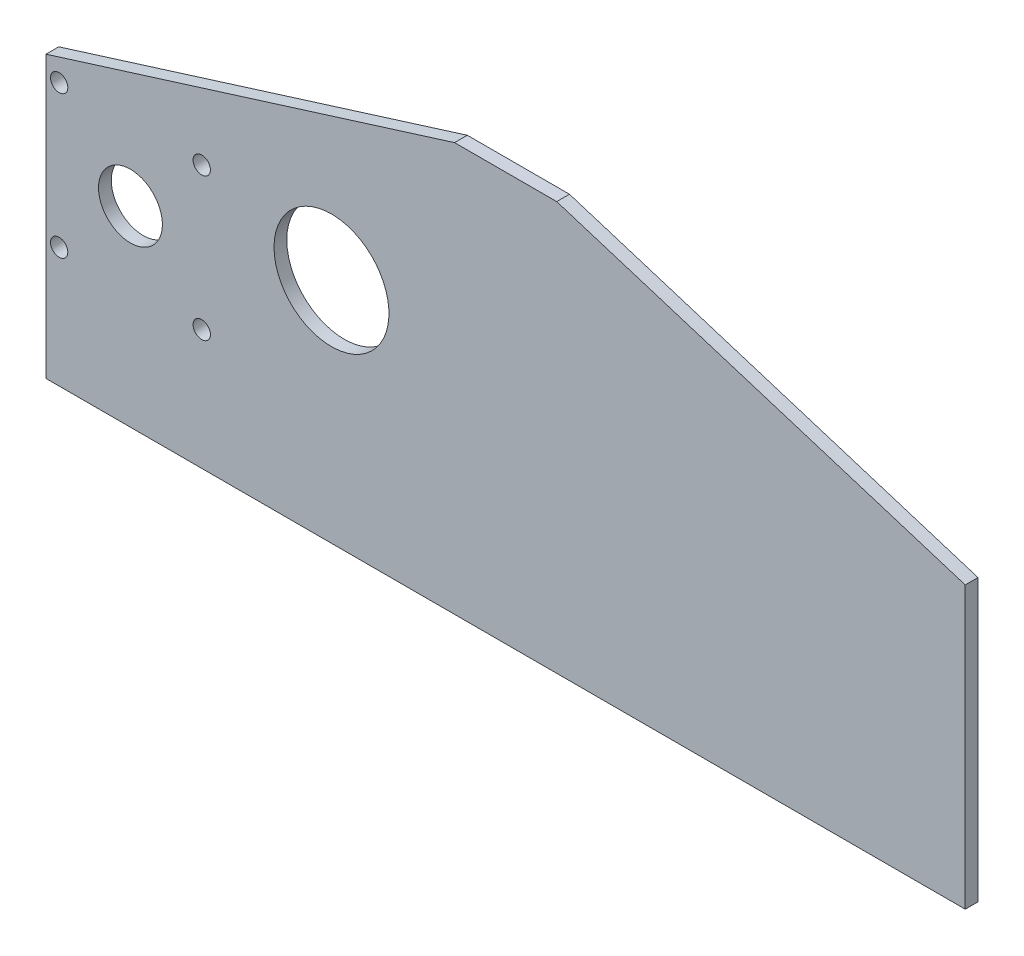
ISO-10303-21;
HEADER;
FILE_DESCRIPTION(('STEP AP214'),'2;1');
FILE_NAME('part.step','',(''),(''),'','','');
FILE_SCHEMA(('AUTOMOTIVE_DESIGN { 1 0 10303 214 1 1 1 1 }'));
ENDSEC;
DATA;
#1=APPLICATION_CONTEXT('core data for automotive mechanical design processes');
#2=APPLICATION_PROTOCOL_DEFINITION('international standard','automotive_design',2000,#1);
#3=PRODUCT_CONTEXT('',#1,'mechanical');
#4=PRODUCT('Part','Part','',(#3));
#5=PRODUCT_RELATED_PRODUCT_CATEGORY('part','',(#4));
#6=PRODUCT_DEFINITION_FORMATION('','',#4);
#7=PRODUCT_DEFINITION_CONTEXT('part definition',#1,'design');
#8=PRODUCT_DEFINITION('design','',#6,#7);
#9=PRODUCT_DEFINITION_SHAPE('','',#8);
#10=(LENGTH_UNIT() NAMED_UNIT(*) SI_UNIT(.MILLI.,.METRE.));
#11=(NAMED_UNIT(*) PLANE_ANGLE_UNIT() SI_UNIT($,.RADIAN.));
#12=(NAMED_UNIT(*) SI_UNIT($,.STERADIAN.) SOLID_ANGLE_UNIT());
#13=UNCERTAINTY_MEASURE_WITH_UNIT(LENGTH_MEASURE(1.E-05),#10,'distance_accuracy_value','');
#14=(GEOMETRIC_REPRESENTATION_CONTEXT(3) GLOBAL_UNCERTAINTY_ASSIGNED_CONTEXT((#13)) GLOBAL_UNIT_ASSIGNED_CONTEXT((#10,
#11,#12)) REPRESENTATION_CONTEXT('',''));
#15=CARTESIAN_POINT('',(0.,0.,0.));
#16=DIRECTION('',(0.,0.,1.));
#17=DIRECTION('',(1.,0.,0.));
#18=AXIS2_PLACEMENT_3D('',#15,#16,#17);
#19=CARTESIAN_POINT('',(25.4,101.6,3.175));
#20=DIRECTION('',(0.,-1.,0.));
#21=DIRECTION('',(1.,0.,0.));
#22=AXIS2_PLACEMENT_3D('',#19,#20,#21);
#23=PLANE('',#22);
#24=DIRECTION('',(-1.,0.,0.));
#25=VECTOR('',#24,1.);
#26=CARTESIAN_POINT('',(25.4,101.6,0.));
#27=LINE('',#26,#25);
#28=CARTESIAN_POINT('',(25.4,101.6,0.));
#29=VERTEX_POINT('',#28);
#30=CARTESIAN_POINT('',(0.,101.6,0.));
#31=VERTEX_POINT('',#30);
#32=EDGE_CURVE('E116',#29,#31,#27,.T.);
#33=ORIENTED_EDGE('',*,*,#32,.T.);
#34=DIRECTION('',(0.,0.,-1.));
#35=VECTOR('',#34,1.);
#36=CARTESIAN_POINT('',(0.,101.6,3.175));
#37=LINE('',#36,#35);
#38=CARTESIAN_POINT('',(0.,101.6,3.175));
#39=VERTEX_POINT('',#38);
#40=EDGE_CURVE('E11',#39,#31,#37,.T.);
#41=ORIENTED_EDGE('',*,*,#40,.F.);
#42=DIRECTION('',(-1.,0.,0.));
#43=VECTOR('',#42,1.);
#44=CARTESIAN_POINT('',(25.4,101.6,3.175));
#45=LINE('',#44,#43);
#46=CARTESIAN_POINT('',(25.4,101.6,3.175));
#47=VERTEX_POINT('',#46);
#48=EDGE_CURVE('E128',#47,#39,#45,.T.);
#49=ORIENTED_EDGE('',*,*,#48,.F.);
#50=DIRECTION('',(0.,0.,-1.));
#51=VECTOR('',#50,1.);
#52=CARTESIAN_POINT('',(25.4,101.6,3.175));
#53=LINE('',#52,#51);
#54=EDGE_CURVE('E112',#47,#29,#53,.T.);
#55=ORIENTED_EDGE('',*,*,#54,.T.);
#56=EDGE_LOOP('',(#33,#41,#49,#55));
#57=FACE_BOUND('',#56,.T.);
#58=ADVANCED_FACE('F33',(#57),#23,.F.);
#59=CARTESIAN_POINT('',(0.,101.6,3.175));
#60=DIRECTION('',(0.298274993135947,-0.95447997803503,0.));
#61=DIRECTION('',(0.95447997803503,0.298274993135947,0.));
#62=AXIS2_PLACEMENT_3D('',#59,#60,#61);
#63=PLANE('',#62);
#64=DIRECTION('',(-0.95447997803503,-0.298274993135947,0.));
#65=VECTOR('',#64,1.);
#66=CARTESIAN_POINT('',(0.,101.6,0.));
#67=LINE('',#66,#65);
#68=CARTESIAN_POINT('',(-101.6,69.85,0.));
#69=VERTEX_POINT('',#68);
#70=EDGE_CURVE('E119',#31,#69,#67,.T.);
#71=ORIENTED_EDGE('',*,*,#70,.T.);
#72=DIRECTION('',(0.,0.,-1.));
#73=VECTOR('',#72,1.);
#74=CARTESIAN_POINT('',(-101.6,69.85,3.175));
#75=LINE('',#74,#73);
#76=CARTESIAN_POINT('',(-101.6,69.85,3.175));
#77=VERTEX_POINT('',#76);
#78=EDGE_CURVE('E41',#77,#69,#75,.T.);
#79=ORIENTED_EDGE('',*,*,#78,.F.);
#80=DIRECTION('',(-0.95447997803503,-0.298274993135947,0.));
#81=VECTOR('',#80,1.);
#82=CARTESIAN_POINT('',(0.,101.6,3.175));
#83=LINE('',#82,#81);
#84=EDGE_CURVE('E86',#39,#77,#83,.T.);
#85=ORIENTED_EDGE('',*,*,#84,.F.);
#86=ORIENTED_EDGE('',*,*,#40,.T.);
#87=EDGE_LOOP('',(#71,#79,#85,#86));
#88=FACE_BOUND('',#87,.T.);
#89=ADVANCED_FACE('F153',(#88),#63,.F.);
#90=CARTESIAN_POINT('',(-101.6,69.85,3.175));
#91=DIRECTION('',(1.,0.,0.));
#92=DIRECTION('',(0.,1.,0.));
#93=AXIS2_PLACEMENT_3D('',#90,#91,#92);
#94=PLANE('',#93);
#95=DIRECTION('',(0.,-1.,0.));
#96=VECTOR('',#95,1.);
#97=CARTESIAN_POINT('',(-101.6,69.85,0.));
#98=LINE('',#97,#96);
#99=CARTESIAN_POINT('',(-101.6,0.,0.));
#100=VERTEX_POINT('',#99);
#101=EDGE_CURVE('E122',#69,#100,#98,.T.);
#102=ORIENTED_EDGE('',*,*,#101,.T.);
#103=DIRECTION('',(0.,0.,-1.));
#104=VECTOR('',#103,1.);
#105=CARTESIAN_POINT('',(-101.6,0.,3.175));
#106=LINE('',#105,#104);
#107=CARTESIAN_POINT('',(-101.6,0.,3.175));
#108=VERTEX_POINT('',#107);
#109=EDGE_CURVE('E107',#108,#100,#106,.T.);
#110=ORIENTED_EDGE('',*,*,#109,.F.);
#111=DIRECTION('',(0.,-1.,0.));
#112=VECTOR('',#111,1.);
#113=CARTESIAN_POINT('',(-101.6,69.85,3.175));
#114=LINE('',#113,#112);
#115=EDGE_CURVE('E99',#77,#108,#114,.T.);
#116=ORIENTED_EDGE('',*,*,#115,.F.);
#117=ORIENTED_EDGE('',*,*,#78,.T.);
#118=EDGE_LOOP('',(#102,#110,#116,#117));
#119=FACE_BOUND('',#118,.T.);
#120=ADVANCED_FACE('F134',(#119),#94,.F.);
#121=CARTESIAN_POINT('',(0.,0.,3.175));
#122=DIRECTION('',(0.,1.,0.));
#123=DIRECTION('',(0.,0.,1.));
#124=AXIS2_PLACEMENT_3D('',#121,#122,#123);
#125=PLANE('',#124);
#126=DIRECTION('',(1.,0.,0.));
#127=VECTOR('',#126,1.);
#128=CARTESIAN_POINT('',(0.,0.,0.));
#129=LINE('',#128,#127);
#130=CARTESIAN_POINT('',(127.,0.,0.));
#131=VERTEX_POINT('',#130);
#132=EDGE_CURVE('E106',#100,#131,#129,.T.);
#133=ORIENTED_EDGE('',*,*,#132,.T.);
#134=DIRECTION('',(0.,0.,-1.));
#135=VECTOR('',#134,1.);
#136=CARTESIAN_POINT('',(127.,0.,3.175));
#137=LINE('',#136,#135);
#138=CARTESIAN_POINT('',(127.,0.,3.175));
#139=VERTEX_POINT('',#138);
#140=EDGE_CURVE('E104',#139,#131,#137,.T.);
#141=ORIENTED_EDGE('',*,*,#140,.F.);
#142=DIRECTION('',(1.,0.,0.));
#143=VECTOR('',#142,1.);
#144=CARTESIAN_POINT('',(-101.6,0.,3.175));
#145=LINE('',#144,#143);
#146=EDGE_CURVE('E93',#108,#139,#145,.T.);
#147=ORIENTED_EDGE('',*,*,#146,.F.);
#148=ORIENTED_EDGE('',*,*,#109,.T.);
#149=EDGE_LOOP('',(#133,#141,#147,#148));
#150=FACE_BOUND('',#149,.T.);
#151=ADVANCED_FACE('F105',(#150),#125,.F.);
#152=CARTESIAN_POINT('',(127.,0.,3.175));
#153=DIRECTION('',(-1.,0.,0.));
#154=DIRECTION('',(0.,-1.,0.));
#155=AXIS2_PLACEMENT_3D('',#152,#153,#154);
#156=PLANE('',#155);
#157=DIRECTION('',(0.,1.,0.));
#158=VECTOR('',#157,1.);
#159=CARTESIAN_POINT('',(127.,0.,0.));
#160=LINE('',#159,#158);
#161=CARTESIAN_POINT('',(127.,69.85,0.));
#162=VERTEX_POINT('',#161);
#163=EDGE_CURVE('E72',#131,#162,#160,.T.);
#164=ORIENTED_EDGE('',*,*,#163,.T.);
#165=DIRECTION('',(0.,0.,-1.));
#166=VECTOR('',#165,1.);
#167=CARTESIAN_POINT('',(127.,69.85,3.175));
#168=LINE('',#167,#166);
#169=CARTESIAN_POINT('',(127.,69.85,3.175));
#170=VERTEX_POINT('',#169);
#171=EDGE_CURVE('E108',#170,#162,#168,.T.);
#172=ORIENTED_EDGE('',*,*,#171,.F.);
#173=DIRECTION('',(0.,1.,0.));
#174=VECTOR('',#173,1.);
#175=CARTESIAN_POINT('',(127.,0.,3.175));
#176=LINE('',#175,#174);
#177=EDGE_CURVE('E97',#139,#170,#176,.T.);
#178=ORIENTED_EDGE('',*,*,#177,.F.);
#179=ORIENTED_EDGE('',*,*,#140,.T.);
#180=EDGE_LOOP('',(#164,#172,#178,#179));
#181=FACE_BOUND('',#180,.T.);
#182=ADVANCED_FACE('F110',(#181),#156,.F.);
#183=CARTESIAN_POINT('',(127.,69.85,3.175));
#184=DIRECTION('',(-0.298274993135947,-0.95447997803503,0.));
#185=DIRECTION('',(0.95447997803503,-0.298274993135947,0.));
#186=AXIS2_PLACEMENT_3D('',#183,#184,#185);
#187=PLANE('',#186);
#188=DIRECTION('',(-0.95447997803503,0.298274993135947,0.));
#189=VECTOR('',#188,1.);
#190=CARTESIAN_POINT('',(127.,69.85,0.));
#191=LINE('',#190,#189);
#192=EDGE_CURVE('E78',#162,#29,#191,.T.);
#193=ORIENTED_EDGE('',*,*,#192,.T.);
#194=ORIENTED_EDGE('',*,*,#54,.F.);
#195=DIRECTION('',(-0.95447997803503,0.298274993135947,0.));
#196=VECTOR('',#195,1.);
#197=CARTESIAN_POINT('',(127.,69.85,3.175));
#198=LINE('',#197,#196);
#199=EDGE_CURVE('E49',#170,#47,#198,.T.);
#200=ORIENTED_EDGE('',*,*,#199,.F.);
#201=ORIENTED_EDGE('',*,*,#171,.T.);
#202=EDGE_LOOP('',(#193,#194,#200,#201));
#203=FACE_BOUND('',#202,.T.);
#204=ADVANCED_FACE('F141',(#203),#187,.F.);
#205=CARTESIAN_POINT('',(0.,0.,3.175));
#206=DIRECTION('',(0.,0.,1.));
#207=DIRECTION('',(1.,0.,0.));
#208=AXIS2_PLACEMENT_3D('',#205,#206,#207);
#209=PLANE('',#208);
#210=CARTESIAN_POINT('',(-30.607,56.6438663921803,3.175));
#211=DIRECTION('',(0.,0.,-1.));
#212=DIRECTION('',(-1.,0.,0.));
#213=AXIS2_PLACEMENT_3D('',#210,#211,#212);
#214=CIRCLE('',#213,14.2875);
#215=CARTESIAN_POINT('',(-44.8945,56.6438663921803,3.175));
#216=VERTEX_POINT('',#215);
#217=EDGE_CURVE('E256',#216,#216,#214,.T.);
#218=ORIENTED_EDGE('',*,*,#217,.T.);
#219=EDGE_LOOP('',(#218));
#220=FACE_BOUND('',#219,.T.);
#221=CARTESIAN_POINT('',(-98.33,29.895,3.175));
#222=DIRECTION('',(0.,0.,-1.));
#223=DIRECTION('',(-1.,0.,0.));
#224=AXIS2_PLACEMENT_3D('',#221,#222,#223);
#225=CIRCLE('',#224,2.15264999999999);
#226=CARTESIAN_POINT('',(-100.48265,29.895,3.175));
#227=VERTEX_POINT('',#226);
#228=EDGE_CURVE('E266',#227,#227,#225,.T.);
#229=ORIENTED_EDGE('',*,*,#228,.T.);
#230=EDGE_LOOP('',(#229));
#231=FACE_BOUND('',#230,.T.);
#232=CARTESIAN_POINT('',(-62.87,65.355,3.175));
#233=DIRECTION('',(0.,0.,-1.));
#234=DIRECTION('',(-1.,0.,0.));
#235=AXIS2_PLACEMENT_3D('',#232,#233,#234);
#236=CIRCLE('',#235,2.15264999999999);
#237=CARTESIAN_POINT('',(-65.02265,65.355,3.175));
#238=VERTEX_POINT('',#237);
#239=EDGE_CURVE('E272',#238,#238,#236,.T.);
#240=ORIENTED_EDGE('',*,*,#239,.T.);
#241=EDGE_LOOP('',(#240));
#242=FACE_BOUND('',#241,.T.);
#243=CARTESIAN_POINT('',(-62.87,29.895,3.175));
#244=DIRECTION('',(0.,0.,-1.));
#245=DIRECTION('',(-1.,0.,0.));
#246=AXIS2_PLACEMENT_3D('',#243,#244,#245);
#247=CIRCLE('',#246,2.15264999999999);
#248=CARTESIAN_POINT('',(-65.02265,29.895,3.175));
#249=VERTEX_POINT('',#248);
#250=EDGE_CURVE('E278',#249,#249,#247,.T.);
#251=ORIENTED_EDGE('',*,*,#250,.T.);
#252=EDGE_LOOP('',(#251));
#253=FACE_BOUND('',#252,.T.);
#254=CARTESIAN_POINT('',(-98.33,65.355,3.175));
#255=DIRECTION('',(0.,0.,-1.));
#256=DIRECTION('',(-1.,0.,0.));
#257=AXIS2_PLACEMENT_3D('',#254,#255,#256);
#258=CIRCLE('',#257,2.15264999999999);
#259=CARTESIAN_POINT('',(-100.48265,65.355,3.175));
#260=VERTEX_POINT('',#259);
#261=EDGE_CURVE('E284',#260,#260,#258,.T.);
#262=ORIENTED_EDGE('',*,*,#261,.T.);
#263=EDGE_LOOP('',(#262));
#264=FACE_BOUND('',#263,.T.);
#265=CARTESIAN_POINT('',(-80.6,47.625,3.175));
#266=DIRECTION('',(0.,0.,-1.));
#267=DIRECTION('',(-1.,0.,0.));
#268=AXIS2_PLACEMENT_3D('',#265,#266,#267);
#269=CIRCLE('',#268,7.93749999999999);
#270=CARTESIAN_POINT('',(-88.5375,47.625,3.175));
#271=VERTEX_POINT('',#270);
#272=EDGE_CURVE('E120',#271,#271,#269,.T.);
#273=ORIENTED_EDGE('',*,*,#272,.T.);
#274=EDGE_LOOP('',(#273));
#275=FACE_BOUND('',#274,.T.);
#276=ORIENTED_EDGE('',*,*,#48,.T.);
#277=ORIENTED_EDGE('',*,*,#84,.T.);
#278=ORIENTED_EDGE('',*,*,#115,.T.);
#279=ORIENTED_EDGE('',*,*,#146,.T.);
#280=ORIENTED_EDGE('',*,*,#177,.T.);
#281=ORIENTED_EDGE('',*,*,#199,.T.);
#282=EDGE_LOOP('',(#276,#277,#278,#279,#280,#281));
#283=FACE_BOUND('',#282,.T.);
#284=ADVANCED_FACE('F95',(#220,#231,#242,#253,#264,#275,#283),#209,.T.);
#285=CARTESIAN_POINT('',(0.,0.,0.));
#286=DIRECTION('',(0.,0.,1.));
#287=DIRECTION('',(1.,0.,0.));
#288=AXIS2_PLACEMENT_3D('',#285,#286,#287);
#289=PLANE('',#288);
#290=CARTESIAN_POINT('',(-30.607,56.6438663921803,0.));
#291=DIRECTION('',(0.,0.,-1.));
#292=DIRECTION('',(-1.,0.,0.));
#293=AXIS2_PLACEMENT_3D('',#290,#291,#292);
#294=CIRCLE('',#293,14.2875);
#295=CARTESIAN_POINT('',(-44.8945,56.6438663921803,0.));
#296=VERTEX_POINT('',#295);
#297=EDGE_CURVE('E259',#296,#296,#294,.T.);
#298=ORIENTED_EDGE('',*,*,#297,.F.);
#299=EDGE_LOOP('',(#298));
#300=FACE_BOUND('',#299,.T.);
#301=CARTESIAN_POINT('',(-98.33,29.895,0.));
#302=DIRECTION('',(0.,0.,-1.));
#303=DIRECTION('',(-1.,0.,0.));
#304=AXIS2_PLACEMENT_3D('',#301,#302,#303);
#305=CIRCLE('',#304,2.15264999999999);
#306=CARTESIAN_POINT('',(-100.48265,29.895,0.));
#307=VERTEX_POINT('',#306);
#308=EDGE_CURVE('E261',#307,#307,#305,.T.);
#309=ORIENTED_EDGE('',*,*,#308,.F.);
#310=EDGE_LOOP('',(#309));
#311=FACE_BOUND('',#310,.T.);
#312=CARTESIAN_POINT('',(-62.87,65.355,0.));
#313=DIRECTION('',(0.,0.,-1.));
#314=DIRECTION('',(-1.,0.,0.));
#315=AXIS2_PLACEMENT_3D('',#312,#313,#314);
#316=CIRCLE('',#315,2.15264999999999);
#317=CARTESIAN_POINT('',(-65.02265,65.355,0.));
#318=VERTEX_POINT('',#317);
#319=EDGE_CURVE('E269',#318,#318,#316,.T.);
#320=ORIENTED_EDGE('',*,*,#319,.F.);
#321=EDGE_LOOP('',(#320));
#322=FACE_BOUND('',#321,.T.);
#323=CARTESIAN_POINT('',(-62.87,29.895,0.));
#324=DIRECTION('',(0.,0.,-1.));
#325=DIRECTION('',(-1.,0.,0.));
#326=AXIS2_PLACEMENT_3D('',#323,#324,#325);
#327=CIRCLE('',#326,2.15264999999999);
#328=CARTESIAN_POINT('',(-65.02265,29.895,0.));
#329=VERTEX_POINT('',#328);
#330=EDGE_CURVE('E275',#329,#329,#327,.T.);
#331=ORIENTED_EDGE('',*,*,#330,.F.);
#332=EDGE_LOOP('',(#331));
#333=FACE_BOUND('',#332,.T.);
#334=CARTESIAN_POINT('',(-98.33,65.355,0.));
#335=DIRECTION('',(0.,0.,-1.));
#336=DIRECTION('',(-1.,0.,0.));
#337=AXIS2_PLACEMENT_3D('',#334,#335,#336);
#338=CIRCLE('',#337,2.15264999999999);
#339=CARTESIAN_POINT('',(-100.48265,65.355,0.));
#340=VERTEX_POINT('',#339);
#341=EDGE_CURVE('E281',#340,#340,#338,.T.);
#342=ORIENTED_EDGE('',*,*,#341,.F.);
#343=EDGE_LOOP('',(#342));
#344=FACE_BOUND('',#343,.T.);
#345=CARTESIAN_POINT('',(-80.6,47.625,0.));
#346=DIRECTION('',(0.,0.,-1.));
#347=DIRECTION('',(-1.,0.,0.));
#348=AXIS2_PLACEMENT_3D('',#345,#346,#347);
#349=CIRCLE('',#348,7.93749999999999);
#350=CARTESIAN_POINT('',(-88.5375,47.625,0.));
#351=VERTEX_POINT('',#350);
#352=EDGE_CURVE('E287',#351,#351,#349,.T.);
#353=ORIENTED_EDGE('',*,*,#352,.F.);
#354=EDGE_LOOP('',(#353));
#355=FACE_BOUND('',#354,.T.);
#356=ORIENTED_EDGE('',*,*,#32,.F.);
#357=ORIENTED_EDGE('',*,*,#192,.F.);
#358=ORIENTED_EDGE('',*,*,#163,.F.);
#359=ORIENTED_EDGE('',*,*,#132,.F.);
#360=ORIENTED_EDGE('',*,*,#101,.F.);
#361=ORIENTED_EDGE('',*,*,#70,.F.);
#362=EDGE_LOOP('',(#356,#357,#358,#359,#360,#361));
#363=FACE_BOUND('',#362,.T.);
#364=ADVANCED_FACE('F137',(#300,#311,#322,#333,#344,#355,#363),#289,.F.);
#365=CARTESIAN_POINT('',(-80.6,47.625,3.175));
#366=DIRECTION('',(0.,0.,-1.));
#367=DIRECTION('',(-1.,0.,0.));
#368=AXIS2_PLACEMENT_3D('',#365,#366,#367);
#369=CYLINDRICAL_SURFACE('',#368,7.93749999999999);
#370=ORIENTED_EDGE('',*,*,#272,.F.);
#371=EDGE_LOOP('',(#370));
#372=FACE_BOUND('',#371,.T.);
#373=ORIENTED_EDGE('',*,*,#352,.T.);
#374=EDGE_LOOP('',(#373));
#375=FACE_BOUND('',#374,.T.);
#376=ADVANCED_FACE('F181',(#372,#375),#369,.F.);
#377=CARTESIAN_POINT('',(-98.33,65.355,0.));
#378=DIRECTION('',(0.,0.,-1.));
#379=DIRECTION('',(-1.,0.,0.));
#380=AXIS2_PLACEMENT_3D('',#377,#378,#379);
#381=CYLINDRICAL_SURFACE('',#380,2.15264999999999);
#382=ORIENTED_EDGE('',*,*,#261,.F.);
#383=EDGE_LOOP('',(#382));
#384=FACE_BOUND('',#383,.T.);
#385=ORIENTED_EDGE('',*,*,#341,.T.);
#386=EDGE_LOOP('',(#385));
#387=FACE_BOUND('',#386,.T.);
#388=ADVANCED_FACE('F186',(#384,#387),#381,.F.);
#389=CARTESIAN_POINT('',(-62.87,29.895,0.));
#390=DIRECTION('',(0.,0.,-1.));
#391=DIRECTION('',(-1.,0.,0.));
#392=AXIS2_PLACEMENT_3D('',#389,#390,#391);
#393=CYLINDRICAL_SURFACE('',#392,2.15264999999999);
#394=ORIENTED_EDGE('',*,*,#250,.F.);
#395=EDGE_LOOP('',(#394));
#396=FACE_BOUND('',#395,.T.);
#397=ORIENTED_EDGE('',*,*,#330,.T.);
#398=EDGE_LOOP('',(#397));
#399=FACE_BOUND('',#398,.T.);
#400=ADVANCED_FACE('F198',(#396,#399),#393,.F.);
#401=CARTESIAN_POINT('',(-62.87,65.355,0.));
#402=DIRECTION('',(0.,0.,-1.));
#403=DIRECTION('',(-1.,0.,0.));
#404=AXIS2_PLACEMENT_3D('',#401,#402,#403);
#405=CYLINDRICAL_SURFACE('',#404,2.15264999999999);
#406=ORIENTED_EDGE('',*,*,#239,.F.);
#407=EDGE_LOOP('',(#406));
#408=FACE_BOUND('',#407,.T.);
#409=ORIENTED_EDGE('',*,*,#319,.T.);
#410=EDGE_LOOP('',(#409));
#411=FACE_BOUND('',#410,.T.);
#412=ADVANCED_FACE('F208',(#408,#411),#405,.F.);
#413=CARTESIAN_POINT('',(-98.33,29.895,0.));
#414=DIRECTION('',(0.,0.,-1.));
#415=DIRECTION('',(-1.,0.,0.));
#416=AXIS2_PLACEMENT_3D('',#413,#414,#415);
#417=CYLINDRICAL_SURFACE('',#416,2.15264999999999);
#418=ORIENTED_EDGE('',*,*,#228,.F.);
#419=EDGE_LOOP('',(#418));
#420=FACE_BOUND('',#419,.T.);
#421=ORIENTED_EDGE('',*,*,#308,.T.);
#422=EDGE_LOOP('',(#421));
#423=FACE_BOUND('',#422,.T.);
#424=ADVANCED_FACE('F218',(#420,#423),#417,.F.);
#425=CARTESIAN_POINT('',(-30.607,56.6438663921803,3.175));
#426=DIRECTION('',(0.,0.,-1.));
#427=DIRECTION('',(-1.,0.,0.));
#428=AXIS2_PLACEMENT_3D('',#425,#426,#427);
#429=CYLINDRICAL_SURFACE('',#428,14.2875);
#430=ORIENTED_EDGE('',*,*,#217,.F.);
#431=EDGE_LOOP('',(#430));
#432=FACE_BOUND('',#431,.T.);
#433=ORIENTED_EDGE('',*,*,#297,.T.);
#434=EDGE_LOOP('',(#433));
#435=FACE_BOUND('',#434,.T.);
#436=ADVANCED_FACE('F228',(#432,#435),#429,.F.);
#437=CLOSED_SHELL('',(#58,#89,#120,#151,#182,#204,#284,#364,#376,#388,#400,#412,#424,#436));
#438=MANIFOLD_SOLID_BREP('B2',#437);
#439=ADVANCED_BREP_SHAPE_REPRESENTATION('',(#18,#438),#14);
#440=SHAPE_DEFINITION_REPRESENTATION(#9,#439);
ENDSEC;
END-ISO-10303-21;
